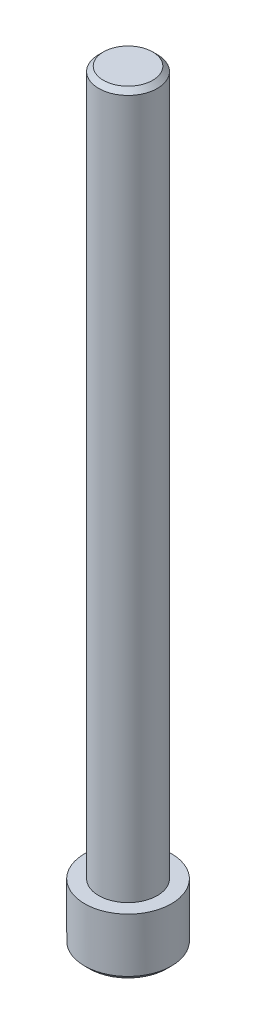
ISO-10303-21;
HEADER;
FILE_DESCRIPTION(('STEP AP214'),'2;1');
FILE_NAME('part.step','',(''),(''),'','','');
FILE_SCHEMA(('AUTOMOTIVE_DESIGN { 1 0 10303 214 1 1 1 1 }'));
ENDSEC;
DATA;
#1=APPLICATION_CONTEXT('core data for automotive mechanical design processes');
#2=APPLICATION_PROTOCOL_DEFINITION('international standard','automotive_design',2000,#1);
#3=PRODUCT_CONTEXT('',#1,'mechanical');
#4=PRODUCT('Part','Part','',(#3));
#5=PRODUCT_RELATED_PRODUCT_CATEGORY('part','',(#4));
#6=PRODUCT_DEFINITION_FORMATION('','',#4);
#7=PRODUCT_DEFINITION_CONTEXT('part definition',#1,'design');
#8=PRODUCT_DEFINITION('design','',#6,#7);
#9=PRODUCT_DEFINITION_SHAPE('','',#8);
#10=(LENGTH_UNIT() NAMED_UNIT(*) SI_UNIT(.MILLI.,.METRE.));
#11=(NAMED_UNIT(*) PLANE_ANGLE_UNIT() SI_UNIT($,.RADIAN.));
#12=(NAMED_UNIT(*) SI_UNIT($,.STERADIAN.) SOLID_ANGLE_UNIT());
#13=UNCERTAINTY_MEASURE_WITH_UNIT(LENGTH_MEASURE(1.E-05),#10,'distance_accuracy_value','');
#14=(GEOMETRIC_REPRESENTATION_CONTEXT(3) GLOBAL_UNCERTAINTY_ASSIGNED_CONTEXT((#13)) GLOBAL_UNIT_ASSIGNED_CONTEXT((#10,
#11,#12)) REPRESENTATION_CONTEXT('',''));
#15=CARTESIAN_POINT('',(0.,0.,0.));
#16=DIRECTION('',(0.,0.,1.));
#17=DIRECTION('',(1.,0.,0.));
#18=AXIS2_PLACEMENT_3D('',#15,#16,#17);
#19=CARTESIAN_POINT('',(0.,-6.35,0.));
#20=DIRECTION('',(0.,1.,0.));
#21=DIRECTION('',(0.,0.,1.));
#22=AXIS2_PLACEMENT_3D('',#19,#20,#21);
#23=PLANE('',#22);
#24=CARTESIAN_POINT('',(0.,-6.34999999999764,0.));
#25=DIRECTION('',(0.,1.,0.));
#26=DIRECTION('',(0.,0.,1.));
#27=AXIS2_PLACEMENT_3D('',#24,#25,#26);
#28=CIRCLE('',#27,4.19099999999162);
#29=CARTESIAN_POINT('',(0.,-6.34999999999764,4.19099999999162));
#30=VERTEX_POINT('',#29);
#31=EDGE_CURVE('E18',#30,#30,#28,.T.);
#32=ORIENTED_EDGE('',*,*,#31,.F.);
#33=EDGE_LOOP('',(#32));
#34=FACE_BOUND('',#33,.T.);
#35=ADVANCED_FACE('F15',(#34),#23,.F.);
#36=CARTESIAN_POINT('',(0.,-5.84199999997281,0.));
#37=DIRECTION('',(0.,1.,0.));
#38=DIRECTION('',(0.,0.,1.));
#39=AXIS2_PLACEMENT_3D('',#36,#37,#38);
#40=CONICAL_SURFACE('',#39,4.69900000001644,0.785398163397448);
#41=CARTESIAN_POINT('',(0.,-5.842,0.));
#42=DIRECTION('',(0.,-1.,0.));
#43=DIRECTION('',(0.,0.,-1.));
#44=AXIS2_PLACEMENT_3D('',#41,#42,#43);
#45=CIRCLE('',#44,4.699);
#46=CARTESIAN_POINT('',(0.,-5.842,-4.699));
#47=VERTEX_POINT('',#46);
#48=EDGE_CURVE('E36',#47,#47,#45,.F.);
#49=ORIENTED_EDGE('',*,*,#48,.F.);
#50=EDGE_LOOP('',(#49));
#51=FACE_BOUND('',#50,.T.);
#52=ORIENTED_EDGE('',*,*,#31,.T.);
#53=EDGE_LOOP('',(#52));
#54=FACE_BOUND('',#53,.T.);
#55=ADVANCED_FACE('F47',(#51,#54),#40,.T.);
#56=CARTESIAN_POINT('',(0.,76.2,0.));
#57=DIRECTION('',(0.,1.,0.));
#58=DIRECTION('',(0.,0.,1.));
#59=AXIS2_PLACEMENT_3D('',#56,#57,#58);
#60=PLANE('',#59);
#61=CARTESIAN_POINT('',(0.,76.1999999999716,0.));
#62=DIRECTION('',(0.,-1.,0.));
#63=DIRECTION('',(0.,0.,-1.));
#64=AXIS2_PLACEMENT_3D('',#61,#62,#63);
#65=CIRCLE('',#64,2.666999999974);
#66=CARTESIAN_POINT('',(0.,76.1999999999716,-2.666999999974));
#67=VERTEX_POINT('',#66);
#68=EDGE_CURVE('E34',#67,#67,#65,.T.);
#69=ORIENTED_EDGE('',*,*,#68,.F.);
#70=EDGE_LOOP('',(#69));
#71=FACE_BOUND('',#70,.T.);
#72=ADVANCED_FACE('F54',(#71),#60,.T.);
#73=CARTESIAN_POINT('',(0.,-6.35,0.));
#74=DIRECTION('',(0.,-1.,0.));
#75=DIRECTION('',(0.,0.,-1.));
#76=AXIS2_PLACEMENT_3D('',#73,#74,#75);
#77=CYLINDRICAL_SURFACE('',#76,4.699);
#78=CARTESIAN_POINT('',(0.,0.,0.));
#79=DIRECTION('',(0.,-1.,0.));
#80=DIRECTION('',(0.,0.,-1.));
#81=AXIS2_PLACEMENT_3D('',#78,#79,#80);
#82=CIRCLE('',#81,4.699);
#83=CARTESIAN_POINT('',(0.,0.,-4.699));
#84=VERTEX_POINT('',#83);
#85=EDGE_CURVE('E27',#84,#84,#82,.F.);
#86=ORIENTED_EDGE('',*,*,#85,.F.);
#87=EDGE_LOOP('',(#86));
#88=FACE_BOUND('',#87,.T.);
#89=ORIENTED_EDGE('',*,*,#48,.T.);
#90=EDGE_LOOP('',(#89));
#91=FACE_BOUND('',#90,.T.);
#92=ADVANCED_FACE('F70',(#88,#91),#77,.T.);
#93=CARTESIAN_POINT('',(0.,75.6920000000036,0.));
#94=DIRECTION('',(0.,-1.,0.));
#95=DIRECTION('',(0.,0.,-1.));
#96=AXIS2_PLACEMENT_3D('',#93,#94,#95);
#97=CONICAL_SURFACE('',#96,3.17499999994197,0.785398163397448);
#98=ORIENTED_EDGE('',*,*,#68,.T.);
#99=EDGE_LOOP('',(#98));
#100=FACE_BOUND('',#99,.T.);
#101=CARTESIAN_POINT('',(0.,75.692,0.));
#102=DIRECTION('',(0.,1.,0.));
#103=DIRECTION('',(0.,0.,1.));
#104=AXIS2_PLACEMENT_3D('',#101,#102,#103);
#105=CIRCLE('',#104,3.175);
#106=CARTESIAN_POINT('',(0.,75.692,3.175));
#107=VERTEX_POINT('',#106);
#108=EDGE_CURVE('E22',#107,#107,#105,.F.);
#109=ORIENTED_EDGE('',*,*,#108,.F.);
#110=EDGE_LOOP('',(#109));
#111=FACE_BOUND('',#110,.T.);
#112=ADVANCED_FACE('F63',(#100,#111),#97,.T.);
#113=CARTESIAN_POINT('',(0.,0.,0.));
#114=DIRECTION('',(0.,1.,0.));
#115=DIRECTION('',(0.,0.,1.));
#116=AXIS2_PLACEMENT_3D('',#113,#114,#115);
#117=PLANE('',#116);
#118=CARTESIAN_POINT('',(0.,0.,0.));
#119=DIRECTION('',(0.,1.,0.));
#120=DIRECTION('',(0.,0.,1.));
#121=AXIS2_PLACEMENT_3D('',#118,#119,#120);
#122=CIRCLE('',#121,3.175);
#123=CARTESIAN_POINT('',(0.,0.,3.175));
#124=VERTEX_POINT('',#123);
#125=EDGE_CURVE('E10',#124,#124,#122,.T.);
#126=ORIENTED_EDGE('',*,*,#125,.F.);
#127=EDGE_LOOP('',(#126));
#128=FACE_BOUND('',#127,.T.);
#129=ORIENTED_EDGE('',*,*,#85,.T.);
#130=EDGE_LOOP('',(#129));
#131=FACE_BOUND('',#130,.T.);
#132=ADVANCED_FACE('F58',(#128,#131),#117,.T.);
#133=CARTESIAN_POINT('',(0.,76.2,0.));
#134=DIRECTION('',(0.,1.,0.));
#135=DIRECTION('',(0.,0.,1.));
#136=AXIS2_PLACEMENT_3D('',#133,#134,#135);
#137=CYLINDRICAL_SURFACE('',#136,3.175);
#138=ORIENTED_EDGE('',*,*,#125,.T.);
#139=EDGE_LOOP('',(#138));
#140=FACE_BOUND('',#139,.T.);
#141=ORIENTED_EDGE('',*,*,#108,.T.);
#142=EDGE_LOOP('',(#141));
#143=FACE_BOUND('',#142,.T.);
#144=ADVANCED_FACE('F56',(#140,#143),#137,.T.);
#145=CLOSED_SHELL('',(#35,#55,#72,#92,#112,#132,#144));
#146=MANIFOLD_SOLID_BREP('B1',#145);
#147=ADVANCED_BREP_SHAPE_REPRESENTATION('',(#18,#146),#14);
#148=SHAPE_DEFINITION_REPRESENTATION(#9,#147);
ENDSEC;
END-ISO-10303-21;
